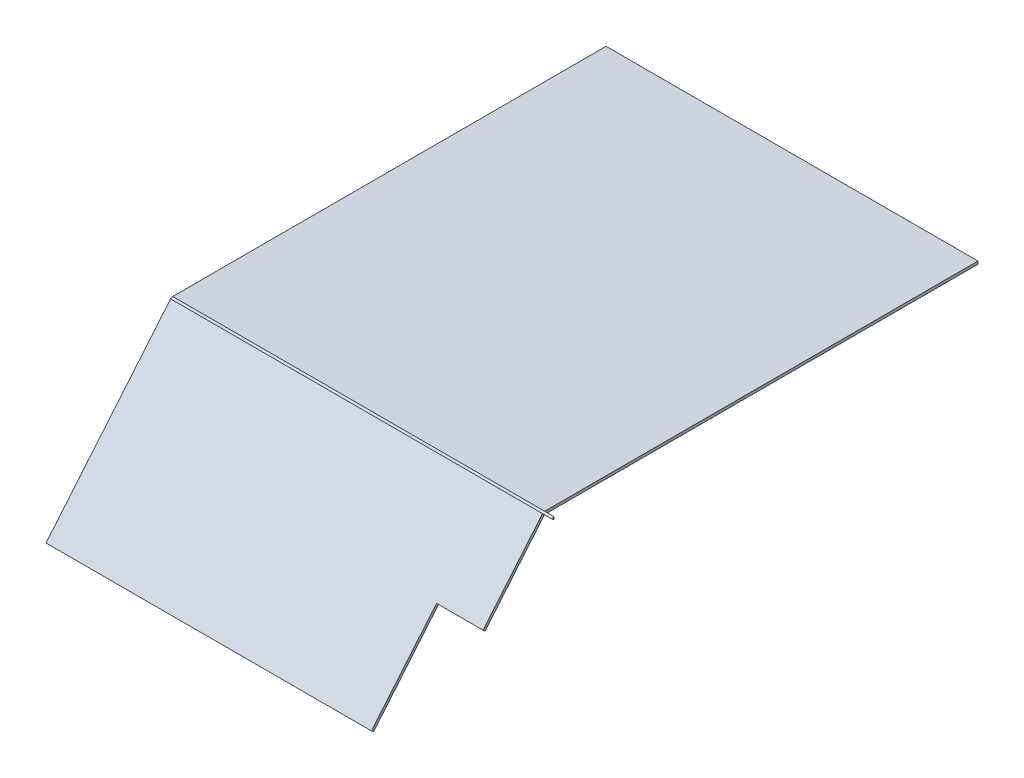
ISO-10303-21;
HEADER;
FILE_DESCRIPTION(('STEP AP214'),'2;1');
FILE_NAME('part.step','',(''),(''),'','','');
FILE_SCHEMA(('AUTOMOTIVE_DESIGN { 1 0 10303 214 1 1 1 1 }'));
ENDSEC;
DATA;
#1=APPLICATION_CONTEXT('core data for automotive mechanical design processes');
#2=APPLICATION_PROTOCOL_DEFINITION('international standard','automotive_design',2000,#1);
#3=PRODUCT_CONTEXT('',#1,'mechanical');
#4=PRODUCT('Part','Part','',(#3));
#5=PRODUCT_RELATED_PRODUCT_CATEGORY('part','',(#4));
#6=PRODUCT_DEFINITION_FORMATION('','',#4);
#7=PRODUCT_DEFINITION_CONTEXT('part definition',#1,'design');
#8=PRODUCT_DEFINITION('design','',#6,#7);
#9=PRODUCT_DEFINITION_SHAPE('','',#8);
#10=(LENGTH_UNIT() NAMED_UNIT(*) SI_UNIT(.MILLI.,.METRE.));
#11=(NAMED_UNIT(*) PLANE_ANGLE_UNIT() SI_UNIT($,.RADIAN.));
#12=(NAMED_UNIT(*) SI_UNIT($,.STERADIAN.) SOLID_ANGLE_UNIT());
#13=UNCERTAINTY_MEASURE_WITH_UNIT(LENGTH_MEASURE(1.E-05),#10,'distance_accuracy_value','');
#14=(GEOMETRIC_REPRESENTATION_CONTEXT(3) GLOBAL_UNCERTAINTY_ASSIGNED_CONTEXT((#13)) GLOBAL_UNIT_ASSIGNED_CONTEXT((#10,
#11,#12)) REPRESENTATION_CONTEXT('',''));
#15=CARTESIAN_POINT('',(0.,0.,0.));
#16=DIRECTION('',(0.,0.,1.));
#17=DIRECTION('',(1.,0.,0.));
#18=AXIS2_PLACEMENT_3D('',#15,#16,#17);
#19=CARTESIAN_POINT('',(0.,133.294447415279,0.));
#20=DIRECTION('',(0.,1.,0.));
#21=DIRECTION('',(0.,0.,1.));
#22=AXIS2_PLACEMENT_3D('',#19,#20,#21);
#23=PLANE('',#22);
#24=DIRECTION('',(-1.,0.,0.));
#25=VECTOR('',#24,1.);
#26=CARTESIAN_POINT('',(82.0664175408914,133.294447415279,787.813069502837));
#27=LINE('',#26,#25);
#28=CARTESIAN_POINT('',(82.0664175408914,133.294447415278,787.813069502837));
#29=VERTEX_POINT('',#28);
#30=CARTESIAN_POINT('',(-317.933582459109,133.294447415279,787.813069502837));
#31=VERTEX_POINT('',#30);
#32=EDGE_CURVE('E149',#29,#31,#27,.T.);
#33=ORIENTED_EDGE('',*,*,#32,.F.);
#34=DIRECTION('',(0.,0.,-1.));
#35=VECTOR('',#34,1.);
#36=CARTESIAN_POINT('',(82.0664175408914,133.294447415279,787.813069502837));
#37=LINE('',#36,#35);
#38=CARTESIAN_POINT('',(82.0664175408914,133.294447415279,321.791546701372));
#39=VERTEX_POINT('',#38);
#40=EDGE_CURVE('E75',#29,#39,#37,.T.);
#41=ORIENTED_EDGE('',*,*,#40,.T.);
#42=DIRECTION('',(-1.,0.,0.));
#43=VECTOR('',#42,1.);
#44=CARTESIAN_POINT('',(82.0664175408914,133.294447415279,321.791546701372));
#45=LINE('',#44,#43);
#46=CARTESIAN_POINT('',(-317.933582459109,133.294447415279,321.791546701372));
#47=VERTEX_POINT('',#46);
#48=EDGE_CURVE('E252',#39,#47,#45,.T.);
#49=ORIENTED_EDGE('',*,*,#48,.T.);
#50=DIRECTION('',(0.,0.,1.));
#51=VECTOR('',#50,1.);
#52=CARTESIAN_POINT('',(-317.933582459109,133.294447415279,321.791546701372));
#53=LINE('',#52,#51);
#54=EDGE_CURVE('E114',#47,#31,#53,.T.);
#55=ORIENTED_EDGE('',*,*,#54,.T.);
#56=EDGE_LOOP('',(#33,#41,#49,#55));
#57=FACE_BOUND('',#56,.T.);
#58=ADVANCED_FACE('F66',(#57),#23,.T.);
#59=CARTESIAN_POINT('',(0.,130.294447415279,0.));
#60=DIRECTION('',(0.,1.,0.));
#61=DIRECTION('',(0.,0.,1.));
#62=AXIS2_PLACEMENT_3D('',#59,#60,#61);
#63=PLANE('',#62);
#64=DIRECTION('',(-1.,0.,0.));
#65=VECTOR('',#64,1.);
#66=CARTESIAN_POINT('',(82.0664175408914,130.294447415279,787.813069502837));
#67=LINE('',#66,#65);
#68=CARTESIAN_POINT('',(82.0664175408914,130.294447415279,787.813069502837));
#69=VERTEX_POINT('',#68);
#70=CARTESIAN_POINT('',(-317.933582459109,130.294447415279,787.813069502838));
#71=VERTEX_POINT('',#70);
#72=EDGE_CURVE('E101',#69,#71,#67,.T.);
#73=ORIENTED_EDGE('',*,*,#72,.T.);
#74=DIRECTION('',(0.,0.,1.));
#75=VECTOR('',#74,1.);
#76=CARTESIAN_POINT('',(-317.933582459109,130.294447415279,321.791546701372));
#77=LINE('',#76,#75);
#78=CARTESIAN_POINT('',(-317.933582459109,130.294447415279,321.791546701372));
#79=VERTEX_POINT('',#78);
#80=EDGE_CURVE('E270',#79,#71,#77,.T.);
#81=ORIENTED_EDGE('',*,*,#80,.F.);
#82=DIRECTION('',(-1.,0.,0.));
#83=VECTOR('',#82,1.);
#84=CARTESIAN_POINT('',(82.0664175408914,130.294447415279,321.791546701372));
#85=LINE('',#84,#83);
#86=CARTESIAN_POINT('',(82.0664175408914,130.294447415279,321.791546701372));
#87=VERTEX_POINT('',#86);
#88=EDGE_CURVE('E152',#87,#79,#85,.T.);
#89=ORIENTED_EDGE('',*,*,#88,.F.);
#90=DIRECTION('',(0.,0.,-1.));
#91=VECTOR('',#90,1.);
#92=CARTESIAN_POINT('',(82.0664175408914,130.294447415279,787.813069502837));
#93=LINE('',#92,#91);
#94=EDGE_CURVE('E12',#69,#87,#93,.T.);
#95=ORIENTED_EDGE('',*,*,#94,.F.);
#96=EDGE_LOOP('',(#73,#81,#89,#95));
#97=FACE_BOUND('',#96,.T.);
#98=ADVANCED_FACE('F151',(#97),#63,.F.);
#99=CARTESIAN_POINT('',(82.0664175408914,130.294447415279,787.813069502837));
#100=DIRECTION('',(1.,0.,0.));
#101=DIRECTION('',(0.,0.,-1.));
#102=AXIS2_PLACEMENT_3D('',#99,#100,#101);
#103=PLANE('',#102);
#104=ORIENTED_EDGE('',*,*,#40,.F.);
#105=DIRECTION('',(0.,1.,0.));
#106=VECTOR('',#105,1.);
#107=CARTESIAN_POINT('',(82.0664175408914,130.294447415279,787.813069502837));
#108=LINE('',#107,#106);
#109=EDGE_CURVE('E115',#69,#29,#108,.T.);
#110=ORIENTED_EDGE('',*,*,#109,.F.);
#111=ORIENTED_EDGE('',*,*,#94,.T.);
#112=DIRECTION('',(0.,1.,0.));
#113=VECTOR('',#112,1.);
#114=CARTESIAN_POINT('',(82.0664175408914,130.294447415279,321.791546701372));
#115=LINE('',#114,#113);
#116=EDGE_CURVE('E277',#87,#39,#115,.T.);
#117=ORIENTED_EDGE('',*,*,#116,.T.);
#118=EDGE_LOOP('',(#104,#110,#111,#117));
#119=FACE_BOUND('',#118,.T.);
#120=ADVANCED_FACE('F144',(#119),#103,.T.);
#121=CARTESIAN_POINT('',(82.0664175408914,130.294447415279,321.791546701372));
#122=DIRECTION('',(0.,0.,-1.));
#123=DIRECTION('',(-1.,0.,0.));
#124=AXIS2_PLACEMENT_3D('',#121,#122,#123);
#125=PLANE('',#124);
#126=ORIENTED_EDGE('',*,*,#48,.F.);
#127=ORIENTED_EDGE('',*,*,#116,.F.);
#128=ORIENTED_EDGE('',*,*,#88,.T.);
#129=DIRECTION('',(0.,1.,0.));
#130=VECTOR('',#129,1.);
#131=CARTESIAN_POINT('',(-317.933582459109,130.294447415279,321.791546701372));
#132=LINE('',#131,#130);
#133=EDGE_CURVE('E256',#79,#47,#132,.T.);
#134=ORIENTED_EDGE('',*,*,#133,.T.);
#135=EDGE_LOOP('',(#126,#127,#128,#134));
#136=FACE_BOUND('',#135,.T.);
#137=ADVANCED_FACE('F294',(#136),#125,.T.);
#138=CARTESIAN_POINT('',(-317.933582459109,130.294447415279,321.791546701372));
#139=DIRECTION('',(-1.,0.,0.));
#140=DIRECTION('',(0.,0.,1.));
#141=AXIS2_PLACEMENT_3D('',#138,#139,#140);
#142=PLANE('',#141);
#143=ORIENTED_EDGE('',*,*,#54,.F.);
#144=ORIENTED_EDGE('',*,*,#133,.F.);
#145=ORIENTED_EDGE('',*,*,#80,.T.);
#146=DIRECTION('',(0.,-0.767452494170678,0.641105817467916));
#147=VECTOR('',#146,1.);
#148=CARTESIAN_POINT('',(-317.933582459109,-30.0879944369985,921.791546701372));
#149=LINE('',#148,#147);
#150=CARTESIAN_POINT('',(-317.933582459109,-30.0879944369985,921.791546701372));
#151=VERTEX_POINT('',#150);
#152=EDGE_CURVE('E110',#71,#151,#149,.T.);
#153=ORIENTED_EDGE('',*,*,#152,.T.);
#154=DIRECTION('',(0.,-0.641105817467916,-0.767452494170678));
#155=VECTOR('',#154,1.);
#156=CARTESIAN_POINT('',(-317.933582459109,-28.1646769845948,924.093904183884));
#157=LINE('',#156,#155);
#158=CARTESIAN_POINT('',(-317.933582459109,-28.1646769845948,924.093904183884));
#159=VERTEX_POINT('',#158);
#160=EDGE_CURVE('E140',#159,#151,#157,.T.);
#161=ORIENTED_EDGE('',*,*,#160,.F.);
#162=DIRECTION('',(0.,-0.767452494170678,0.641105817467916));
#163=VECTOR('',#162,1.);
#164=CARTESIAN_POINT('',(-317.933582459109,-28.1646769845948,924.093904183884));
#165=LINE('',#164,#163);
#166=CARTESIAN_POINT('',(-317.933582459109,132.217764867682,790.11542698535));
#167=VERTEX_POINT('',#166);
#168=EDGE_CURVE('E218',#167,#159,#165,.T.);
#169=ORIENTED_EDGE('',*,*,#168,.F.);
#170=DIRECTION('',(0.,-0.423611958360529,0.905843755144317));
#171=VECTOR('',#170,1.);
#172=CARTESIAN_POINT('',(-317.933582459109,52.0265439415437,961.59480866871));
#173=LINE('',#172,#171);
#174=EDGE_CURVE('E177',#31,#167,#173,.T.);
#175=ORIENTED_EDGE('',*,*,#174,.F.);
#176=EDGE_LOOP('',(#143,#144,#145,#153,#161,#169,#175));
#177=FACE_BOUND('',#176,.T.);
#178=ADVANCED_FACE('F263',(#177),#142,.T.);
#179=CARTESIAN_POINT('',(92.0664175408911,-28.1646769845898,787.813069502831));
#180=DIRECTION('',(0.,0.,1.));
#181=DIRECTION('',(0.,-1.,0.));
#182=AXIS2_PLACEMENT_3D('',#179,#180,#181);
#183=PLANE('',#182);
#184=DIRECTION('',(-1.,0.,0.));
#185=VECTOR('',#184,1.);
#186=CARTESIAN_POINT('',(92.0664175408912,130.294447415278,787.813069502837));
#187=LINE('',#186,#185);
#188=CARTESIAN_POINT('',(92.0664175408912,130.294447415278,787.813069502837));
#189=VERTEX_POINT('',#188);
#190=EDGE_CURVE('E137',#189,#69,#187,.T.);
#191=ORIENTED_EDGE('',*,*,#190,.T.);
#192=ORIENTED_EDGE('',*,*,#109,.T.);
#193=DIRECTION('',(-1.,0.,0.));
#194=VECTOR('',#193,1.);
#195=CARTESIAN_POINT('',(92.0664175408912,133.294447415278,787.813069502837));
#196=LINE('',#195,#194);
#197=CARTESIAN_POINT('',(92.0664175408912,133.294447415278,787.813069502837));
#198=VERTEX_POINT('',#197);
#199=EDGE_CURVE('E159',#198,#29,#196,.T.);
#200=ORIENTED_EDGE('',*,*,#199,.F.);
#201=DIRECTION('',(0.,1.,0.));
#202=VECTOR('',#201,1.);
#203=CARTESIAN_POINT('',(92.0664175408911,-28.1646769845898,787.813069502831));
#204=LINE('',#203,#202);
#205=EDGE_CURVE('E157',#189,#198,#204,.T.);
#206=ORIENTED_EDGE('',*,*,#205,.F.);
#207=EDGE_LOOP('',(#191,#192,#200,#206));
#208=FACE_BOUND('',#207,.T.);
#209=ADVANCED_FACE('F155',(#208),#183,.F.);
#210=CARTESIAN_POINT('',(92.0664175408912,132.217764867683,790.11542698535));
#211=DIRECTION('',(0.,0.76745249417068,-0.641105817467914));
#212=DIRECTION('',(0.,0.641105817467914,0.76745249417068));
#213=AXIS2_PLACEMENT_3D('',#210,#211,#212);
#214=PLANE('',#213);
#215=DIRECTION('',(-1.,0.,0.));
#216=VECTOR('',#215,1.);
#217=CARTESIAN_POINT('',(92.0664175408912,132.217764867682,790.115426985349));
#218=LINE('',#217,#216);
#219=CARTESIAN_POINT('',(92.0664175408912,132.217764867682,790.115426985349));
#220=VERTEX_POINT('',#219);
#221=CARTESIAN_POINT('',(82.0664175408914,132.217764867682,790.115426985349));
#222=VERTEX_POINT('',#221);
#223=EDGE_CURVE('E139',#220,#222,#218,.T.);
#224=ORIENTED_EDGE('',*,*,#223,.T.);
#225=DIRECTION('',(0.,-0.641105817467916,-0.767452494170678));
#226=VECTOR('',#225,1.);
#227=CARTESIAN_POINT('',(82.0664175408914,132.217764867682,790.115426985349));
#228=LINE('',#227,#226);
#229=EDGE_CURVE('E124',#222,#69,#228,.T.);
#230=ORIENTED_EDGE('',*,*,#229,.T.);
#231=ORIENTED_EDGE('',*,*,#190,.F.);
#232=DIRECTION('',(0.,-0.641105817467914,-0.76745249417068));
#233=VECTOR('',#232,1.);
#234=CARTESIAN_POINT('',(92.0664175408912,132.217764867683,790.11542698535));
#235=LINE('',#234,#233);
#236=EDGE_CURVE('E175',#220,#189,#235,.T.);
#237=ORIENTED_EDGE('',*,*,#236,.F.);
#238=EDGE_LOOP('',(#224,#230,#231,#237));
#239=FACE_BOUND('',#238,.T.);
#240=ADVANCED_FACE('F133',(#239),#214,.F.);
#241=CARTESIAN_POINT('',(92.0664175408912,52.0265439415435,961.59480866871));
#242=DIRECTION('',(0.,-0.905843755144317,-0.423611958360529));
#243=DIRECTION('',(0.,0.423611958360529,-0.905843755144317));
#244=AXIS2_PLACEMENT_3D('',#241,#242,#243);
#245=PLANE('',#244);
#246=ORIENTED_EDGE('',*,*,#174,.T.);
#247=DIRECTION('',(-1.,0.,0.));
#248=VECTOR('',#247,1.);
#249=CARTESIAN_POINT('',(-317.933582459109,132.217764867682,790.11542698535));
#250=LINE('',#249,#248);
#251=EDGE_CURVE('E215',#222,#167,#250,.T.);
#252=ORIENTED_EDGE('',*,*,#251,.F.);
#253=ORIENTED_EDGE('',*,*,#223,.F.);
#254=DIRECTION('',(0.,-0.423611958360529,0.905843755144317));
#255=VECTOR('',#254,1.);
#256=CARTESIAN_POINT('',(92.0664175408912,52.0265439415435,961.59480866871));
#257=LINE('',#256,#255);
#258=EDGE_CURVE('E171',#198,#220,#257,.T.);
#259=ORIENTED_EDGE('',*,*,#258,.F.);
#260=ORIENTED_EDGE('',*,*,#199,.T.);
#261=ORIENTED_EDGE('',*,*,#32,.T.);
#262=EDGE_LOOP('',(#246,#252,#253,#259,#260,#261));
#263=FACE_BOUND('',#262,.T.);
#264=ADVANCED_FACE('F260',(#263),#245,.F.);
#265=CARTESIAN_POINT('',(92.0664175408913,0.,0.));
#266=DIRECTION('',(-1.,0.,0.));
#267=DIRECTION('',(0.,-1.,0.));
#268=AXIS2_PLACEMENT_3D('',#265,#266,#267);
#269=PLANE('',#268);
#270=ORIENTED_EDGE('',*,*,#236,.T.);
#271=ORIENTED_EDGE('',*,*,#205,.T.);
#272=ORIENTED_EDGE('',*,*,#258,.T.);
#273=EDGE_LOOP('',(#270,#271,#272));
#274=FACE_BOUND('',#273,.T.);
#275=ADVANCED_FACE('F318',(#274),#269,.F.);
#276=CARTESIAN_POINT('',(32.0664175408913,-28.1646769845948,924.093904183884));
#277=DIRECTION('',(0.,0.767452494170678,-0.641105817467916));
#278=DIRECTION('',(0.,0.641105817467916,0.767452494170678));
#279=AXIS2_PLACEMENT_3D('',#276,#277,#278);
#280=PLANE('',#279);
#281=DIRECTION('',(1.,0.,0.));
#282=VECTOR('',#281,1.);
#283=CARTESIAN_POINT('',(32.0664175408913,-30.0879944369986,921.791546701372));
#284=LINE('',#283,#282);
#285=CARTESIAN_POINT('',(32.0664175408913,-30.0879944369986,921.791546701372));
#286=VERTEX_POINT('',#285);
#287=EDGE_CURVE('E220',#151,#286,#284,.T.);
#288=ORIENTED_EDGE('',*,*,#287,.T.);
#289=DIRECTION('',(0.,-0.641105817467916,-0.767452494170678));
#290=VECTOR('',#289,1.);
#291=CARTESIAN_POINT('',(32.0664175408913,-28.1646769845948,924.093904183884));
#292=LINE('',#291,#290);
#293=CARTESIAN_POINT('',(32.0664175408913,-28.1646769845948,924.093904183884));
#294=VERTEX_POINT('',#293);
#295=EDGE_CURVE('E178',#294,#286,#292,.T.);
#296=ORIENTED_EDGE('',*,*,#295,.F.);
#297=DIRECTION('',(1.,0.,0.));
#298=VECTOR('',#297,1.);
#299=CARTESIAN_POINT('',(32.0664175408913,-28.1646769845948,924.093904183884));
#300=LINE('',#299,#298);
#301=EDGE_CURVE('E193',#159,#294,#300,.T.);
#302=ORIENTED_EDGE('',*,*,#301,.F.);
#303=ORIENTED_EDGE('',*,*,#160,.T.);
#304=EDGE_LOOP('',(#288,#296,#302,#303));
#305=FACE_BOUND('',#304,.T.);
#306=ADVANCED_FACE('F321',(#305),#280,.F.);
#307=CARTESIAN_POINT('',(32.0664175408913,55.6306546567935,854.093904183884));
#308=DIRECTION('',(-1.,0.,0.));
#309=DIRECTION('',(0.,0.,1.));
#310=AXIS2_PLACEMENT_3D('',#307,#308,#309);
#311=PLANE('',#310);
#312=DIRECTION('',(0.,0.767452494170678,-0.641105817467916));
#313=VECTOR('',#312,1.);
#314=CARTESIAN_POINT('',(32.0664175408913,53.7073372043898,851.791546701372));
#315=LINE('',#314,#313);
#316=CARTESIAN_POINT('',(32.0664175408913,53.7073372043898,851.791546701372));
#317=VERTEX_POINT('',#316);
#318=EDGE_CURVE('E223',#286,#317,#315,.T.);
#319=ORIENTED_EDGE('',*,*,#318,.T.);
#320=DIRECTION('',(0.,-0.641105817467916,-0.767452494170678));
#321=VECTOR('',#320,1.);
#322=CARTESIAN_POINT('',(32.0664175408913,55.6306546567935,854.093904183884));
#323=LINE('',#322,#321);
#324=CARTESIAN_POINT('',(32.0664175408913,55.6306546567935,854.093904183884));
#325=VERTEX_POINT('',#324);
#326=EDGE_CURVE('E181',#325,#317,#323,.T.);
#327=ORIENTED_EDGE('',*,*,#326,.F.);
#328=DIRECTION('',(0.,0.767452494170678,-0.641105817467916));
#329=VECTOR('',#328,1.);
#330=CARTESIAN_POINT('',(32.0664175408913,55.6306546567935,854.093904183884));
#331=LINE('',#330,#329);
#332=EDGE_CURVE('E199',#294,#325,#331,.T.);
#333=ORIENTED_EDGE('',*,*,#332,.F.);
#334=ORIENTED_EDGE('',*,*,#295,.T.);
#335=EDGE_LOOP('',(#319,#327,#333,#334));
#336=FACE_BOUND('',#335,.T.);
#337=ADVANCED_FACE('F324',(#336),#311,.F.);
#338=CARTESIAN_POINT('',(82.0664175408914,55.6306546567934,854.093904183884));
#339=DIRECTION('',(0.,0.767452494170678,-0.641105817467916));
#340=DIRECTION('',(0.,0.641105817467916,0.767452494170678));
#341=AXIS2_PLACEMENT_3D('',#338,#339,#340);
#342=PLANE('',#341);
#343=DIRECTION('',(1.,0.,0.));
#344=VECTOR('',#343,1.);
#345=CARTESIAN_POINT('',(82.0664175408914,53.7073372043897,851.791546701372));
#346=LINE('',#345,#344);
#347=CARTESIAN_POINT('',(82.0664175408914,53.7073372043897,851.791546701372));
#348=VERTEX_POINT('',#347);
#349=EDGE_CURVE('E128',#317,#348,#346,.T.);
#350=ORIENTED_EDGE('',*,*,#349,.T.);
#351=DIRECTION('',(0.,-0.641105817467916,-0.767452494170678));
#352=VECTOR('',#351,1.);
#353=CARTESIAN_POINT('',(82.0664175408914,55.6306546567934,854.093904183884));
#354=LINE('',#353,#352);
#355=CARTESIAN_POINT('',(82.0664175408914,55.6306546567934,854.093904183884));
#356=VERTEX_POINT('',#355);
#357=EDGE_CURVE('E127',#356,#348,#354,.T.);
#358=ORIENTED_EDGE('',*,*,#357,.F.);
#359=DIRECTION('',(1.,0.,0.));
#360=VECTOR('',#359,1.);
#361=CARTESIAN_POINT('',(82.0664175408914,55.6306546567934,854.093904183884));
#362=LINE('',#361,#360);
#363=EDGE_CURVE('E207',#325,#356,#362,.T.);
#364=ORIENTED_EDGE('',*,*,#363,.F.);
#365=ORIENTED_EDGE('',*,*,#326,.T.);
#366=EDGE_LOOP('',(#350,#358,#364,#365));
#367=FACE_BOUND('',#366,.T.);
#368=ADVANCED_FACE('F227',(#367),#342,.F.);
#369=CARTESIAN_POINT('',(82.0664175408914,132.217764867682,790.115426985349));
#370=DIRECTION('',(-1.,0.,0.));
#371=DIRECTION('',(0.,-1.,0.));
#372=AXIS2_PLACEMENT_3D('',#369,#370,#371);
#373=PLANE('',#372);
#374=DIRECTION('',(0.,0.767452494170678,-0.641105817467916));
#375=VECTOR('',#374,1.);
#376=CARTESIAN_POINT('',(82.0664175408914,130.294447415279,787.813069502837));
#377=LINE('',#376,#375);
#378=EDGE_CURVE('E107',#348,#69,#377,.T.);
#379=ORIENTED_EDGE('',*,*,#378,.T.);
#380=ORIENTED_EDGE('',*,*,#229,.F.);
#381=DIRECTION('',(0.,0.767452494170678,-0.641105817467916));
#382=VECTOR('',#381,1.);
#383=CARTESIAN_POINT('',(82.0664175408914,132.217764867682,790.115426985349));
#384=LINE('',#383,#382);
#385=EDGE_CURVE('E212',#356,#222,#384,.T.);
#386=ORIENTED_EDGE('',*,*,#385,.F.);
#387=ORIENTED_EDGE('',*,*,#357,.T.);
#388=EDGE_LOOP('',(#379,#380,#386,#387));
#389=FACE_BOUND('',#388,.T.);
#390=ADVANCED_FACE('F121',(#389),#373,.F.);
#391=CARTESIAN_POINT('',(2.38053897050055E-13,443.094921836189,530.418370341122));
#392=DIRECTION('',(0.,-0.641105817467916,-0.767452494170678));
#393=DIRECTION('',(0.,0.767452494170678,-0.641105817467916));
#394=AXIS2_PLACEMENT_3D('',#391,#392,#393);
#395=PLANE('',#394);
#396=ORIENTED_EDGE('',*,*,#301,.T.);
#397=ORIENTED_EDGE('',*,*,#332,.T.);
#398=ORIENTED_EDGE('',*,*,#363,.T.);
#399=ORIENTED_EDGE('',*,*,#385,.T.);
#400=ORIENTED_EDGE('',*,*,#251,.T.);
#401=ORIENTED_EDGE('',*,*,#168,.T.);
#402=EDGE_LOOP('',(#396,#397,#398,#399,#400,#401));
#403=FACE_BOUND('',#402,.T.);
#404=ADVANCED_FACE('F332',(#403),#395,.F.);
#405=CARTESIAN_POINT('',(2.37493141042204E-13,441.171604383785,528.11601285861));
#406=DIRECTION('',(0.,-0.641105817467916,-0.767452494170678));
#407=DIRECTION('',(0.,0.767452494170678,-0.641105817467916));
#408=AXIS2_PLACEMENT_3D('',#405,#406,#407);
#409=PLANE('',#408);
#410=ORIENTED_EDGE('',*,*,#287,.F.);
#411=ORIENTED_EDGE('',*,*,#152,.F.);
#412=ORIENTED_EDGE('',*,*,#72,.F.);
#413=ORIENTED_EDGE('',*,*,#378,.F.);
#414=ORIENTED_EDGE('',*,*,#349,.F.);
#415=ORIENTED_EDGE('',*,*,#318,.F.);
#416=EDGE_LOOP('',(#410,#411,#412,#413,#414,#415));
#417=FACE_BOUND('',#416,.T.);
#418=ADVANCED_FACE('F104',(#417),#409,.T.);
#419=CLOSED_SHELL('',(#58,#98,#120,#137,#178,#209,#240,#264,#275,#306,#337,#368,#390,#404,#418));
#420=MANIFOLD_SOLID_BREP('B2',#419);
#421=ADVANCED_BREP_SHAPE_REPRESENTATION('',(#18,#420),#14);
#422=SHAPE_DEFINITION_REPRESENTATION(#9,#421);
ENDSEC;
END-ISO-10303-21;
